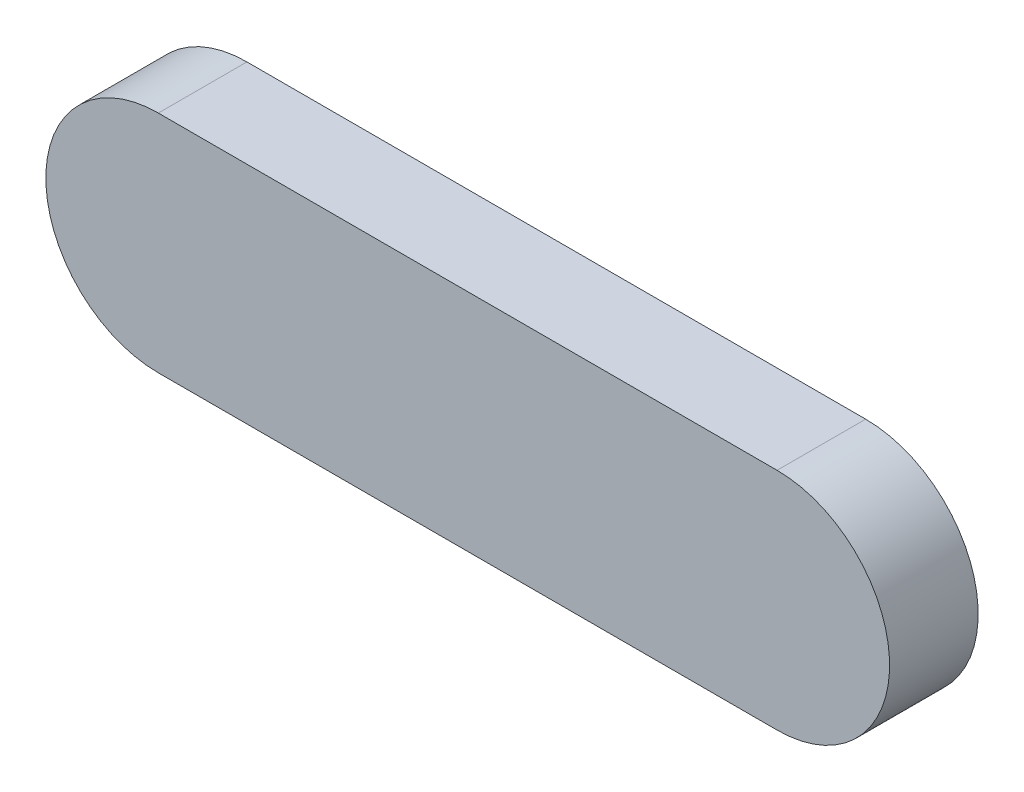
ISO-10303-21;
HEADER;
FILE_DESCRIPTION(('STEP AP214'),'2;1');
FILE_NAME('part.step','',(''),(''),'','','');
FILE_SCHEMA(('AUTOMOTIVE_DESIGN { 1 0 10303 214 1 1 1 1 }'));
ENDSEC;
DATA;
#1=APPLICATION_CONTEXT('core data for automotive mechanical design processes');
#2=APPLICATION_PROTOCOL_DEFINITION('international standard','automotive_design',2000,#1);
#3=PRODUCT_CONTEXT('',#1,'mechanical');
#4=PRODUCT('Part','Part','',(#3));
#5=PRODUCT_RELATED_PRODUCT_CATEGORY('part','',(#4));
#6=PRODUCT_DEFINITION_FORMATION('','',#4);
#7=PRODUCT_DEFINITION_CONTEXT('part definition',#1,'design');
#8=PRODUCT_DEFINITION('design','',#6,#7);
#9=PRODUCT_DEFINITION_SHAPE('','',#8);
#10=(LENGTH_UNIT() NAMED_UNIT(*) SI_UNIT(.MILLI.,.METRE.));
#11=(NAMED_UNIT(*) PLANE_ANGLE_UNIT() SI_UNIT($,.RADIAN.));
#12=(NAMED_UNIT(*) SI_UNIT($,.STERADIAN.) SOLID_ANGLE_UNIT());
#13=UNCERTAINTY_MEASURE_WITH_UNIT(LENGTH_MEASURE(1.E-05),#10,'distance_accuracy_value','');
#14=(GEOMETRIC_REPRESENTATION_CONTEXT(3) GLOBAL_UNCERTAINTY_ASSIGNED_CONTEXT((#13)) GLOBAL_UNIT_ASSIGNED_CONTEXT((#10,
#11,#12)) REPRESENTATION_CONTEXT('',''));
#15=CARTESIAN_POINT('',(0.,0.,0.));
#16=DIRECTION('',(0.,0.,1.));
#17=DIRECTION('',(1.,0.,0.));
#18=AXIS2_PLACEMENT_3D('',#15,#16,#17);
#19=CARTESIAN_POINT('',(139.192,56.515,0.));
#20=DIRECTION('',(0.,1.,0.));
#21=DIRECTION('',(1.,0.,0.));
#22=AXIS2_PLACEMENT_3D('',#19,#20,#21);
#23=PLANE('',#22);
#24=DIRECTION('',(1.,0.,0.));
#25=VECTOR('',#24,1.);
#26=CARTESIAN_POINT('',(139.192,56.515,0.1999996));
#27=LINE('',#26,#25);
#28=CARTESIAN_POINT('',(139.192,56.515,0.1999996));
#29=VERTEX_POINT('',#28);
#30=CARTESIAN_POINT('',(140.589,56.515,0.1999996));
#31=VERTEX_POINT('',#30);
#32=EDGE_CURVE('E11',#29,#31,#27,.T.);
#33=ORIENTED_EDGE('',*,*,#32,.F.);
#34=DIRECTION('',(0.,0.,1.));
#35=VECTOR('',#34,1.);
#36=CARTESIAN_POINT('',(139.192,56.515,0.));
#37=LINE('',#36,#35);
#38=CARTESIAN_POINT('',(139.192,56.515,0.));
#39=VERTEX_POINT('',#38);
#40=EDGE_CURVE('E24',#39,#29,#37,.T.);
#41=ORIENTED_EDGE('',*,*,#40,.F.);
#42=DIRECTION('',(1.,0.,0.));
#43=VECTOR('',#42,1.);
#44=CARTESIAN_POINT('',(139.192,56.515,0.));
#45=LINE('',#44,#43);
#46=CARTESIAN_POINT('',(140.589,56.515,0.));
#47=VERTEX_POINT('',#46);
#48=EDGE_CURVE('E75',#39,#47,#45,.T.);
#49=ORIENTED_EDGE('',*,*,#48,.T.);
#50=DIRECTION('',(0.,0.,1.));
#51=VECTOR('',#50,1.);
#52=CARTESIAN_POINT('',(140.589,56.515,0.));
#53=LINE('',#52,#51);
#54=EDGE_CURVE('E37',#47,#31,#53,.T.);
#55=ORIENTED_EDGE('',*,*,#54,.T.);
#56=EDGE_LOOP('',(#33,#41,#49,#55));
#57=FACE_BOUND('',#56,.T.);
#58=ADVANCED_FACE('F17',(#57),#23,.F.);
#59=CARTESIAN_POINT('',(140.589,56.769,0.));
#60=DIRECTION('',(0.,0.,-1.));
#61=DIRECTION('',(0.,-1.,0.));
#62=AXIS2_PLACEMENT_3D('',#59,#60,#61);
#63=CYLINDRICAL_SURFACE('',#62,0.253999999999998);
#64=CARTESIAN_POINT('',(140.589,56.769,0.1999996));
#65=DIRECTION('',(0.,0.,1.));
#66=DIRECTION('',(0.,-1.,0.));
#67=AXIS2_PLACEMENT_3D('',#64,#65,#66);
#68=CIRCLE('',#67,0.253999999999998);
#69=CARTESIAN_POINT('',(140.589,57.023,0.1999996));
#70=VERTEX_POINT('',#69);
#71=EDGE_CURVE('E83',#31,#70,#68,.T.);
#72=ORIENTED_EDGE('',*,*,#71,.F.);
#73=ORIENTED_EDGE('',*,*,#54,.F.);
#74=CARTESIAN_POINT('',(140.589,56.769,0.));
#75=DIRECTION('',(0.,0.,1.));
#76=DIRECTION('',(0.,-1.,0.));
#77=AXIS2_PLACEMENT_3D('',#74,#75,#76);
#78=CIRCLE('',#77,0.253999999999998);
#79=CARTESIAN_POINT('',(140.589,57.023,0.));
#80=VERTEX_POINT('',#79);
#81=EDGE_CURVE('E81',#47,#80,#78,.T.);
#82=ORIENTED_EDGE('',*,*,#81,.T.);
#83=DIRECTION('',(0.,0.,1.));
#84=VECTOR('',#83,1.);
#85=CARTESIAN_POINT('',(140.589,57.023,0.));
#86=LINE('',#85,#84);
#87=EDGE_CURVE('E67',#80,#70,#86,.T.);
#88=ORIENTED_EDGE('',*,*,#87,.T.);
#89=EDGE_LOOP('',(#72,#73,#82,#88));
#90=FACE_BOUND('',#89,.T.);
#91=ADVANCED_FACE('F89',(#90),#63,.T.);
#92=CARTESIAN_POINT('',(140.589,57.023,0.));
#93=DIRECTION('',(0.,-1.,0.));
#94=DIRECTION('',(-1.,0.,0.));
#95=AXIS2_PLACEMENT_3D('',#92,#93,#94);
#96=PLANE('',#95);
#97=DIRECTION('',(-1.,0.,0.));
#98=VECTOR('',#97,1.);
#99=CARTESIAN_POINT('',(140.589,57.023,0.1999996));
#100=LINE('',#99,#98);
#101=CARTESIAN_POINT('',(139.192,57.023,0.1999996));
#102=VERTEX_POINT('',#101);
#103=EDGE_CURVE('E71',#70,#102,#100,.T.);
#104=ORIENTED_EDGE('',*,*,#103,.F.);
#105=ORIENTED_EDGE('',*,*,#87,.F.);
#106=DIRECTION('',(-1.,0.,0.));
#107=VECTOR('',#106,1.);
#108=CARTESIAN_POINT('',(140.589,57.023,0.));
#109=LINE('',#108,#107);
#110=CARTESIAN_POINT('',(139.192,57.023,0.));
#111=VERTEX_POINT('',#110);
#112=EDGE_CURVE('E63',#80,#111,#109,.T.);
#113=ORIENTED_EDGE('',*,*,#112,.T.);
#114=DIRECTION('',(0.,0.,1.));
#115=VECTOR('',#114,1.);
#116=CARTESIAN_POINT('',(139.192,57.023,0.));
#117=LINE('',#116,#115);
#118=EDGE_CURVE('E53',#111,#102,#117,.T.);
#119=ORIENTED_EDGE('',*,*,#118,.T.);
#120=EDGE_LOOP('',(#104,#105,#113,#119));
#121=FACE_BOUND('',#120,.T.);
#122=ADVANCED_FACE('F66',(#121),#96,.F.);
#123=CARTESIAN_POINT('',(139.192,56.769,0.));
#124=DIRECTION('',(0.,0.,-1.));
#125=DIRECTION('',(1.11896493820489E-13,1.,0.));
#126=AXIS2_PLACEMENT_3D('',#123,#124,#125);
#127=CYLINDRICAL_SURFACE('',#126,0.253999999999998);
#128=CARTESIAN_POINT('',(139.192,56.769,0.1999996));
#129=DIRECTION('',(0.,0.,1.));
#130=DIRECTION('',(1.11896493820489E-13,1.,0.));
#131=AXIS2_PLACEMENT_3D('',#128,#129,#130);
#132=CIRCLE('',#131,0.253999999999998);
#133=EDGE_CURVE('E59',#102,#29,#132,.T.);
#134=ORIENTED_EDGE('',*,*,#133,.F.);
#135=ORIENTED_EDGE('',*,*,#118,.F.);
#136=CARTESIAN_POINT('',(139.192,56.769,0.));
#137=DIRECTION('',(0.,0.,1.));
#138=DIRECTION('',(1.11896493820489E-13,1.,0.));
#139=AXIS2_PLACEMENT_3D('',#136,#137,#138);
#140=CIRCLE('',#139,0.253999999999998);
#141=EDGE_CURVE('E57',#111,#39,#140,.T.);
#142=ORIENTED_EDGE('',*,*,#141,.T.);
#143=ORIENTED_EDGE('',*,*,#40,.T.);
#144=EDGE_LOOP('',(#134,#135,#142,#143));
#145=FACE_BOUND('',#144,.T.);
#146=ADVANCED_FACE('F55',(#145),#127,.T.);
#147=CARTESIAN_POINT('',(139.192,56.515,0.));
#148=DIRECTION('',(0.,0.,-1.));
#149=DIRECTION('',(-1.,0.,0.));
#150=AXIS2_PLACEMENT_3D('',#147,#148,#149);
#151=PLANE('',#150);
#152=ORIENTED_EDGE('',*,*,#141,.F.);
#153=ORIENTED_EDGE('',*,*,#112,.F.);
#154=ORIENTED_EDGE('',*,*,#81,.F.);
#155=ORIENTED_EDGE('',*,*,#48,.F.);
#156=EDGE_LOOP('',(#152,#153,#154,#155));
#157=FACE_BOUND('',#156,.T.);
#158=ADVANCED_FACE('F74',(#157),#151,.T.);
#159=CARTESIAN_POINT('',(139.192,56.515,0.1999996));
#160=DIRECTION('',(0.,0.,-1.));
#161=DIRECTION('',(-1.,0.,0.));
#162=AXIS2_PLACEMENT_3D('',#159,#160,#161);
#163=PLANE('',#162);
#164=ORIENTED_EDGE('',*,*,#32,.T.);
#165=ORIENTED_EDGE('',*,*,#71,.T.);
#166=ORIENTED_EDGE('',*,*,#103,.T.);
#167=ORIENTED_EDGE('',*,*,#133,.T.);
#168=EDGE_LOOP('',(#164,#165,#166,#167));
#169=FACE_BOUND('',#168,.T.);
#170=ADVANCED_FACE('F91',(#169),#163,.F.);
#171=CLOSED_SHELL('',(#58,#91,#122,#146,#158,#170));
#172=MANIFOLD_SOLID_BREP('B1',#171);
#173=ADVANCED_BREP_SHAPE_REPRESENTATION('',(#18,#172),#14);
#174=SHAPE_DEFINITION_REPRESENTATION(#9,#173);
ENDSEC;
END-ISO-10303-21;
